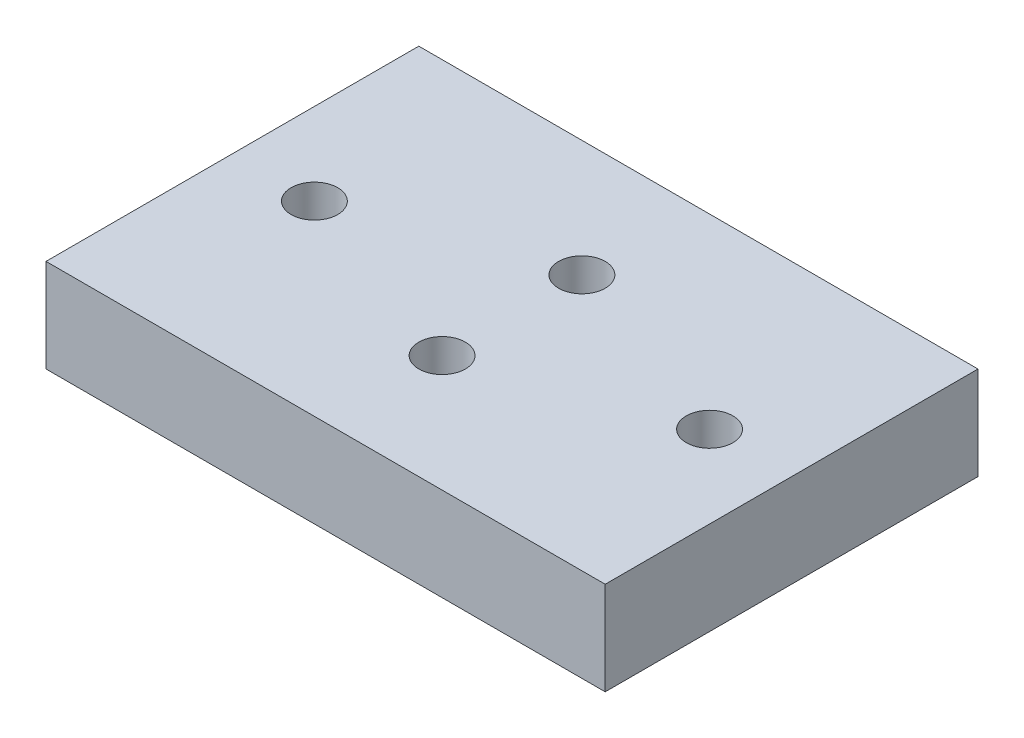
ISO-10303-21;
HEADER;
FILE_DESCRIPTION(('STEP AP214'),'2;1');
FILE_NAME('part.step','',(''),(''),'','','');
FILE_SCHEMA(('AUTOMOTIVE_DESIGN { 1 0 10303 214 1 1 1 1 }'));
ENDSEC;
DATA;
#1=APPLICATION_CONTEXT('core data for automotive mechanical design processes');
#2=APPLICATION_PROTOCOL_DEFINITION('international standard','automotive_design',2000,#1);
#3=PRODUCT_CONTEXT('',#1,'mechanical');
#4=PRODUCT('Part','Part','',(#3));
#5=PRODUCT_RELATED_PRODUCT_CATEGORY('part','',(#4));
#6=PRODUCT_DEFINITION_FORMATION('','',#4);
#7=PRODUCT_DEFINITION_CONTEXT('part definition',#1,'design');
#8=PRODUCT_DEFINITION('design','',#6,#7);
#9=PRODUCT_DEFINITION_SHAPE('','',#8);
#10=(LENGTH_UNIT() NAMED_UNIT(*) SI_UNIT(.MILLI.,.METRE.));
#11=(NAMED_UNIT(*) PLANE_ANGLE_UNIT() SI_UNIT($,.RADIAN.));
#12=(NAMED_UNIT(*) SI_UNIT($,.STERADIAN.) SOLID_ANGLE_UNIT());
#13=UNCERTAINTY_MEASURE_WITH_UNIT(LENGTH_MEASURE(1.E-05),#10,'distance_accuracy_value','');
#14=(GEOMETRIC_REPRESENTATION_CONTEXT(3) GLOBAL_UNCERTAINTY_ASSIGNED_CONTEXT((#13)) GLOBAL_UNIT_ASSIGNED_CONTEXT((#10,
#11,#12)) REPRESENTATION_CONTEXT('',''));
#15=CARTESIAN_POINT('',(0.,0.,0.));
#16=DIRECTION('',(0.,0.,1.));
#17=DIRECTION('',(1.,0.,0.));
#18=AXIS2_PLACEMENT_3D('',#15,#16,#17);
#19=CARTESIAN_POINT('',(30.,10.,27.5));
#20=DIRECTION('',(0.,-1.,0.));
#21=DIRECTION('',(0.,0.,-1.));
#22=AXIS2_PLACEMENT_3D('',#19,#20,#21);
#23=CYLINDRICAL_SURFACE('',#22,2.5);
#24=CARTESIAN_POINT('',(30.,10.,27.5));
#25=DIRECTION('',(0.,1.,0.));
#26=DIRECTION('',(0.,0.,1.));
#27=AXIS2_PLACEMENT_3D('',#24,#25,#26);
#28=CIRCLE('',#27,2.5);
#29=CARTESIAN_POINT('',(30.,10.,30.));
#30=VERTEX_POINT('',#29);
#31=EDGE_CURVE('E132',#30,#30,#28,.T.);
#32=ORIENTED_EDGE('',*,*,#31,.T.);
#33=EDGE_LOOP('',(#32));
#34=FACE_BOUND('',#33,.T.);
#35=CARTESIAN_POINT('',(30.,5.,27.5));
#36=DIRECTION('',(0.,-1.,0.));
#37=DIRECTION('',(0.,0.,-1.));
#38=AXIS2_PLACEMENT_3D('',#35,#36,#37);
#39=CIRCLE('',#38,2.5);
#40=CARTESIAN_POINT('',(30.,5.,25.));
#41=VERTEX_POINT('',#40);
#42=EDGE_CURVE('E37',#41,#41,#39,.T.);
#43=ORIENTED_EDGE('',*,*,#42,.T.);
#44=EDGE_LOOP('',(#43));
#45=FACE_BOUND('',#44,.T.);
#46=ADVANCED_FACE('F33',(#34,#45),#23,.F.);
#47=CARTESIAN_POINT('',(30.,10.,12.5));
#48=DIRECTION('',(0.,-1.,0.));
#49=DIRECTION('',(0.,0.,-1.));
#50=AXIS2_PLACEMENT_3D('',#47,#48,#49);
#51=CYLINDRICAL_SURFACE('',#50,2.49999999999999);
#52=CARTESIAN_POINT('',(30.,10.,12.5));
#53=DIRECTION('',(0.,1.,0.));
#54=DIRECTION('',(0.,0.,-1.));
#55=AXIS2_PLACEMENT_3D('',#52,#53,#54);
#56=CIRCLE('',#55,2.49999999999999);
#57=CARTESIAN_POINT('',(30.,10.,10.));
#58=VERTEX_POINT('',#57);
#59=EDGE_CURVE('E115',#58,#58,#56,.T.);
#60=ORIENTED_EDGE('',*,*,#59,.T.);
#61=EDGE_LOOP('',(#60));
#62=FACE_BOUND('',#61,.T.);
#63=CARTESIAN_POINT('',(30.,5.,12.5));
#64=DIRECTION('',(0.,-1.,0.));
#65=DIRECTION('',(0.,0.,-1.));
#66=AXIS2_PLACEMENT_3D('',#63,#64,#65);
#67=CIRCLE('',#66,2.49999999999999);
#68=CARTESIAN_POINT('',(30.,5.,10.));
#69=VERTEX_POINT('',#68);
#70=EDGE_CURVE('E109',#69,#69,#67,.T.);
#71=ORIENTED_EDGE('',*,*,#70,.T.);
#72=EDGE_LOOP('',(#71));
#73=FACE_BOUND('',#72,.T.);
#74=ADVANCED_FACE('F166',(#62,#73),#51,.F.);
#75=CARTESIAN_POINT('',(0.,10.,0.));
#76=DIRECTION('',(0.,-1.,0.));
#77=DIRECTION('',(0.,0.,-1.));
#78=AXIS2_PLACEMENT_3D('',#75,#76,#77);
#79=PLANE('',#78);
#80=DIRECTION('',(-1.,0.,0.));
#81=VECTOR('',#80,1.);
#82=CARTESIAN_POINT('',(0.,10.,0.));
#83=LINE('',#82,#81);
#84=CARTESIAN_POINT('',(60.,10.,0.));
#85=VERTEX_POINT('',#84);
#86=CARTESIAN_POINT('',(0.,10.,0.));
#87=VERTEX_POINT('',#86);
#88=EDGE_CURVE('E88',#85,#87,#83,.T.);
#89=ORIENTED_EDGE('',*,*,#88,.T.);
#90=DIRECTION('',(0.,0.,1.));
#91=VECTOR('',#90,1.);
#92=CARTESIAN_POINT('',(0.,10.,0.));
#93=LINE('',#92,#91);
#94=CARTESIAN_POINT('',(0.,10.,40.));
#95=VERTEX_POINT('',#94);
#96=EDGE_CURVE('E82',#87,#95,#93,.T.);
#97=ORIENTED_EDGE('',*,*,#96,.T.);
#98=DIRECTION('',(1.,0.,0.));
#99=VECTOR('',#98,1.);
#100=CARTESIAN_POINT('',(0.,10.,40.));
#101=LINE('',#100,#99);
#102=CARTESIAN_POINT('',(60.,10.,40.));
#103=VERTEX_POINT('',#102);
#104=EDGE_CURVE('E86',#95,#103,#101,.T.);
#105=ORIENTED_EDGE('',*,*,#104,.T.);
#106=DIRECTION('',(0.,0.,-1.));
#107=VECTOR('',#106,1.);
#108=CARTESIAN_POINT('',(60.,10.,0.));
#109=LINE('',#108,#107);
#110=EDGE_CURVE('E52',#103,#85,#109,.T.);
#111=ORIENTED_EDGE('',*,*,#110,.T.);
#112=EDGE_LOOP('',(#89,#97,#105,#111));
#113=FACE_BOUND('',#112,.T.);
#114=CARTESIAN_POINT('',(51.2,10.,20.));
#115=DIRECTION('',(0.,1.,0.));
#116=DIRECTION('',(0.,0.,1.));
#117=AXIS2_PLACEMENT_3D('',#114,#115,#116);
#118=CIRCLE('',#117,2.5);
#119=CARTESIAN_POINT('',(51.2,10.,22.5));
#120=VERTEX_POINT('',#119);
#121=EDGE_CURVE('E104',#120,#120,#118,.T.);
#122=ORIENTED_EDGE('',*,*,#121,.F.);
#123=EDGE_LOOP('',(#122));
#124=FACE_BOUND('',#123,.T.);
#125=CARTESIAN_POINT('',(8.8,10.,20.));
#126=DIRECTION('',(0.,1.,0.));
#127=DIRECTION('',(0.,0.,-1.));
#128=AXIS2_PLACEMENT_3D('',#125,#126,#127);
#129=CIRCLE('',#128,2.5);
#130=CARTESIAN_POINT('',(8.8,10.,17.5));
#131=VERTEX_POINT('',#130);
#132=EDGE_CURVE('E136',#131,#131,#129,.T.);
#133=ORIENTED_EDGE('',*,*,#132,.F.);
#134=EDGE_LOOP('',(#133));
#135=FACE_BOUND('',#134,.T.);
#136=ORIENTED_EDGE('',*,*,#31,.F.);
#137=EDGE_LOOP('',(#136));
#138=FACE_BOUND('',#137,.T.);
#139=ORIENTED_EDGE('',*,*,#59,.F.);
#140=EDGE_LOOP('',(#139));
#141=FACE_BOUND('',#140,.T.);
#142=ADVANCED_FACE('F83',(#113,#124,#135,#138,#141),#79,.F.);
#143=CARTESIAN_POINT('',(0.,0.,0.));
#144=DIRECTION('',(0.,-1.,0.));
#145=DIRECTION('',(0.,0.,-1.));
#146=AXIS2_PLACEMENT_3D('',#143,#144,#145);
#147=PLANE('',#146);
#148=CARTESIAN_POINT('',(30.,0.,27.5));
#149=DIRECTION('',(0.,-1.,0.));
#150=DIRECTION('',(0.,0.,-1.));
#151=AXIS2_PLACEMENT_3D('',#148,#149,#150);
#152=CIRCLE('',#151,5.);
#153=CARTESIAN_POINT('',(30.,0.,22.5));
#154=VERTEX_POINT('',#153);
#155=EDGE_CURVE('E117',#154,#154,#152,.T.);
#156=ORIENTED_EDGE('',*,*,#155,.F.);
#157=EDGE_LOOP('',(#156));
#158=FACE_BOUND('',#157,.T.);
#159=CARTESIAN_POINT('',(30.,0.,12.5));
#160=DIRECTION('',(0.,-1.,0.));
#161=DIRECTION('',(0.,0.,-1.));
#162=AXIS2_PLACEMENT_3D('',#159,#160,#161);
#163=CIRCLE('',#162,5.);
#164=CARTESIAN_POINT('',(30.,0.,7.5));
#165=VERTEX_POINT('',#164);
#166=EDGE_CURVE('E127',#165,#165,#163,.T.);
#167=ORIENTED_EDGE('',*,*,#166,.F.);
#168=EDGE_LOOP('',(#167));
#169=FACE_BOUND('',#168,.T.);
#170=CARTESIAN_POINT('',(51.2,0.,20.));
#171=DIRECTION('',(0.,1.,0.));
#172=DIRECTION('',(0.,0.,1.));
#173=AXIS2_PLACEMENT_3D('',#170,#171,#172);
#174=CIRCLE('',#173,2.5);
#175=CARTESIAN_POINT('',(51.2,0.,22.5));
#176=VERTEX_POINT('',#175);
#177=EDGE_CURVE('E139',#176,#176,#174,.T.);
#178=ORIENTED_EDGE('',*,*,#177,.T.);
#179=EDGE_LOOP('',(#178));
#180=FACE_BOUND('',#179,.T.);
#181=DIRECTION('',(-1.,0.,0.));
#182=VECTOR('',#181,1.);
#183=CARTESIAN_POINT('',(0.,0.,0.));
#184=LINE('',#183,#182);
#185=CARTESIAN_POINT('',(60.,0.,0.));
#186=VERTEX_POINT('',#185);
#187=CARTESIAN_POINT('',(0.,0.,0.));
#188=VERTEX_POINT('',#187);
#189=EDGE_CURVE('E101',#186,#188,#184,.T.);
#190=ORIENTED_EDGE('',*,*,#189,.F.);
#191=DIRECTION('',(0.,0.,-1.));
#192=VECTOR('',#191,1.);
#193=CARTESIAN_POINT('',(60.,0.,0.));
#194=LINE('',#193,#192);
#195=CARTESIAN_POINT('',(60.,0.,40.));
#196=VERTEX_POINT('',#195);
#197=EDGE_CURVE('E75',#196,#186,#194,.T.);
#198=ORIENTED_EDGE('',*,*,#197,.F.);
#199=DIRECTION('',(1.,0.,0.));
#200=VECTOR('',#199,1.);
#201=CARTESIAN_POINT('',(0.,0.,40.));
#202=LINE('',#201,#200);
#203=CARTESIAN_POINT('',(0.,0.,40.));
#204=VERTEX_POINT('',#203);
#205=EDGE_CURVE('E69',#204,#196,#202,.T.);
#206=ORIENTED_EDGE('',*,*,#205,.F.);
#207=DIRECTION('',(0.,0.,1.));
#208=VECTOR('',#207,1.);
#209=CARTESIAN_POINT('',(0.,0.,0.));
#210=LINE('',#209,#208);
#211=EDGE_CURVE('E92',#188,#204,#210,.T.);
#212=ORIENTED_EDGE('',*,*,#211,.F.);
#213=EDGE_LOOP('',(#190,#198,#206,#212));
#214=FACE_BOUND('',#213,.T.);
#215=CARTESIAN_POINT('',(8.8,0.,20.));
#216=DIRECTION('',(0.,1.,0.));
#217=DIRECTION('',(0.,0.,-1.));
#218=AXIS2_PLACEMENT_3D('',#215,#216,#217);
#219=CIRCLE('',#218,2.5);
#220=CARTESIAN_POINT('',(8.8,0.,17.5));
#221=VERTEX_POINT('',#220);
#222=EDGE_CURVE('E135',#221,#221,#219,.T.);
#223=ORIENTED_EDGE('',*,*,#222,.T.);
#224=EDGE_LOOP('',(#223));
#225=FACE_BOUND('',#224,.T.);
#226=ADVANCED_FACE('F147',(#158,#169,#180,#214,#225),#147,.T.);
#227=CARTESIAN_POINT('',(0.,10.,0.));
#228=DIRECTION('',(0.,0.,1.));
#229=DIRECTION('',(1.,0.,0.));
#230=AXIS2_PLACEMENT_3D('',#227,#228,#229);
#231=PLANE('',#230);
#232=ORIENTED_EDGE('',*,*,#189,.T.);
#233=DIRECTION('',(0.,-1.,0.));
#234=VECTOR('',#233,1.);
#235=CARTESIAN_POINT('',(0.,10.,0.));
#236=LINE('',#235,#234);
#237=EDGE_CURVE('E11',#87,#188,#236,.T.);
#238=ORIENTED_EDGE('',*,*,#237,.F.);
#239=ORIENTED_EDGE('',*,*,#88,.F.);
#240=DIRECTION('',(0.,-1.,0.));
#241=VECTOR('',#240,1.);
#242=CARTESIAN_POINT('',(60.,10.,0.));
#243=LINE('',#242,#241);
#244=EDGE_CURVE('E97',#85,#186,#243,.T.);
#245=ORIENTED_EDGE('',*,*,#244,.T.);
#246=EDGE_LOOP('',(#232,#238,#239,#245));
#247=FACE_BOUND('',#246,.T.);
#248=ADVANCED_FACE('F35',(#247),#231,.F.);
#249=CARTESIAN_POINT('',(0.,10.,0.));
#250=DIRECTION('',(1.,0.,0.));
#251=DIRECTION('',(0.,0.,-1.));
#252=AXIS2_PLACEMENT_3D('',#249,#250,#251);
#253=PLANE('',#252);
#254=ORIENTED_EDGE('',*,*,#211,.T.);
#255=DIRECTION('',(0.,-1.,0.));
#256=VECTOR('',#255,1.);
#257=CARTESIAN_POINT('',(0.,10.,40.));
#258=LINE('',#257,#256);
#259=EDGE_CURVE('E43',#95,#204,#258,.T.);
#260=ORIENTED_EDGE('',*,*,#259,.F.);
#261=ORIENTED_EDGE('',*,*,#96,.F.);
#262=ORIENTED_EDGE('',*,*,#237,.T.);
#263=EDGE_LOOP('',(#254,#260,#261,#262));
#264=FACE_BOUND('',#263,.T.);
#265=ADVANCED_FACE('F91',(#264),#253,.F.);
#266=CARTESIAN_POINT('',(0.,10.,40.));
#267=DIRECTION('',(0.,0.,-1.));
#268=DIRECTION('',(-1.,0.,0.));
#269=AXIS2_PLACEMENT_3D('',#266,#267,#268);
#270=PLANE('',#269);
#271=ORIENTED_EDGE('',*,*,#205,.T.);
#272=DIRECTION('',(0.,-1.,0.));
#273=VECTOR('',#272,1.);
#274=CARTESIAN_POINT('',(60.,10.,40.));
#275=LINE('',#274,#273);
#276=EDGE_CURVE('E93',#103,#196,#275,.T.);
#277=ORIENTED_EDGE('',*,*,#276,.F.);
#278=ORIENTED_EDGE('',*,*,#104,.F.);
#279=ORIENTED_EDGE('',*,*,#259,.T.);
#280=EDGE_LOOP('',(#271,#277,#278,#279));
#281=FACE_BOUND('',#280,.T.);
#282=ADVANCED_FACE('F95',(#281),#270,.F.);
#283=CARTESIAN_POINT('',(60.,10.,0.));
#284=DIRECTION('',(-1.,0.,0.));
#285=DIRECTION('',(0.,0.,1.));
#286=AXIS2_PLACEMENT_3D('',#283,#284,#285);
#287=PLANE('',#286);
#288=ORIENTED_EDGE('',*,*,#197,.T.);
#289=ORIENTED_EDGE('',*,*,#244,.F.);
#290=ORIENTED_EDGE('',*,*,#110,.F.);
#291=ORIENTED_EDGE('',*,*,#276,.T.);
#292=EDGE_LOOP('',(#288,#289,#290,#291));
#293=FACE_BOUND('',#292,.T.);
#294=ADVANCED_FACE('F153',(#293),#287,.F.);
#295=CARTESIAN_POINT('',(51.2,10.,20.));
#296=DIRECTION('',(0.,-1.,0.));
#297=DIRECTION('',(0.,0.,-1.));
#298=AXIS2_PLACEMENT_3D('',#295,#296,#297);
#299=CYLINDRICAL_SURFACE('',#298,2.5);
#300=ORIENTED_EDGE('',*,*,#121,.T.);
#301=EDGE_LOOP('',(#300));
#302=FACE_BOUND('',#301,.T.);
#303=ORIENTED_EDGE('',*,*,#177,.F.);
#304=EDGE_LOOP('',(#303));
#305=FACE_BOUND('',#304,.T.);
#306=ADVANCED_FACE('F150',(#302,#305),#299,.F.);
#307=CARTESIAN_POINT('',(8.8,10.,20.));
#308=DIRECTION('',(0.,-1.,0.));
#309=DIRECTION('',(0.,0.,-1.));
#310=AXIS2_PLACEMENT_3D('',#307,#308,#309);
#311=CYLINDRICAL_SURFACE('',#310,2.5);
#312=ORIENTED_EDGE('',*,*,#132,.T.);
#313=EDGE_LOOP('',(#312));
#314=FACE_BOUND('',#313,.T.);
#315=ORIENTED_EDGE('',*,*,#222,.F.);
#316=EDGE_LOOP('',(#315));
#317=FACE_BOUND('',#316,.T.);
#318=ADVANCED_FACE('F152',(#314,#317),#311,.F.);
#319=CARTESIAN_POINT('',(30.,5.,12.5));
#320=DIRECTION('',(0.,-1.,0.));
#321=DIRECTION('',(0.,0.,-1.));
#322=AXIS2_PLACEMENT_3D('',#319,#320,#321);
#323=CYLINDRICAL_SURFACE('',#322,5.);
#324=CARTESIAN_POINT('',(30.,5.,12.5));
#325=DIRECTION('',(0.,-1.,0.));
#326=DIRECTION('',(0.,0.,-1.));
#327=AXIS2_PLACEMENT_3D('',#324,#325,#326);
#328=CIRCLE('',#327,5.);
#329=CARTESIAN_POINT('',(30.,5.,7.5));
#330=VERTEX_POINT('',#329);
#331=EDGE_CURVE('E122',#330,#330,#328,.T.);
#332=ORIENTED_EDGE('',*,*,#331,.F.);
#333=EDGE_LOOP('',(#332));
#334=FACE_BOUND('',#333,.T.);
#335=ORIENTED_EDGE('',*,*,#166,.T.);
#336=EDGE_LOOP('',(#335));
#337=FACE_BOUND('',#336,.T.);
#338=ADVANCED_FACE('F160',(#334,#337),#323,.F.);
#339=CARTESIAN_POINT('',(30.,5.,12.5));
#340=DIRECTION('',(0.,-1.,0.));
#341=DIRECTION('',(0.,0.,-1.));
#342=AXIS2_PLACEMENT_3D('',#339,#340,#341);
#343=PLANE('',#342);
#344=ORIENTED_EDGE('',*,*,#70,.F.);
#345=EDGE_LOOP('',(#344));
#346=FACE_BOUND('',#345,.T.);
#347=ORIENTED_EDGE('',*,*,#331,.T.);
#348=EDGE_LOOP('',(#347));
#349=FACE_BOUND('',#348,.T.);
#350=ADVANCED_FACE('F178',(#346,#349),#343,.T.);
#351=CARTESIAN_POINT('',(30.,5.,27.5));
#352=DIRECTION('',(0.,-1.,0.));
#353=DIRECTION('',(0.,0.,-1.));
#354=AXIS2_PLACEMENT_3D('',#351,#352,#353);
#355=CYLINDRICAL_SURFACE('',#354,5.);
#356=CARTESIAN_POINT('',(30.,5.,27.5));
#357=DIRECTION('',(0.,-1.,0.));
#358=DIRECTION('',(0.,0.,-1.));
#359=AXIS2_PLACEMENT_3D('',#356,#357,#358);
#360=CIRCLE('',#359,5.);
#361=CARTESIAN_POINT('',(30.,5.,22.5));
#362=VERTEX_POINT('',#361);
#363=EDGE_CURVE('E111',#362,#362,#360,.T.);
#364=ORIENTED_EDGE('',*,*,#363,.F.);
#365=EDGE_LOOP('',(#364));
#366=FACE_BOUND('',#365,.T.);
#367=ORIENTED_EDGE('',*,*,#155,.T.);
#368=EDGE_LOOP('',(#367));
#369=FACE_BOUND('',#368,.T.);
#370=ADVANCED_FACE('F182',(#366,#369),#355,.F.);
#371=CARTESIAN_POINT('',(30.,5.,27.5));
#372=DIRECTION('',(0.,-1.,0.));
#373=DIRECTION('',(0.,0.,-1.));
#374=AXIS2_PLACEMENT_3D('',#371,#372,#373);
#375=PLANE('',#374);
#376=ORIENTED_EDGE('',*,*,#42,.F.);
#377=EDGE_LOOP('',(#376));
#378=FACE_BOUND('',#377,.T.);
#379=ORIENTED_EDGE('',*,*,#363,.T.);
#380=EDGE_LOOP('',(#379));
#381=FACE_BOUND('',#380,.T.);
#382=ADVANCED_FACE('F186',(#378,#381),#375,.T.);
#383=CLOSED_SHELL('',(#46,#74,#142,#226,#248,#265,#282,#294,#306,#318,#338,#350,#370,#382));
#384=MANIFOLD_SOLID_BREP('B2',#383);
#385=ADVANCED_BREP_SHAPE_REPRESENTATION('',(#18,#384),#14);
#386=SHAPE_DEFINITION_REPRESENTATION(#9,#385);
ENDSEC;
END-ISO-10303-21;
